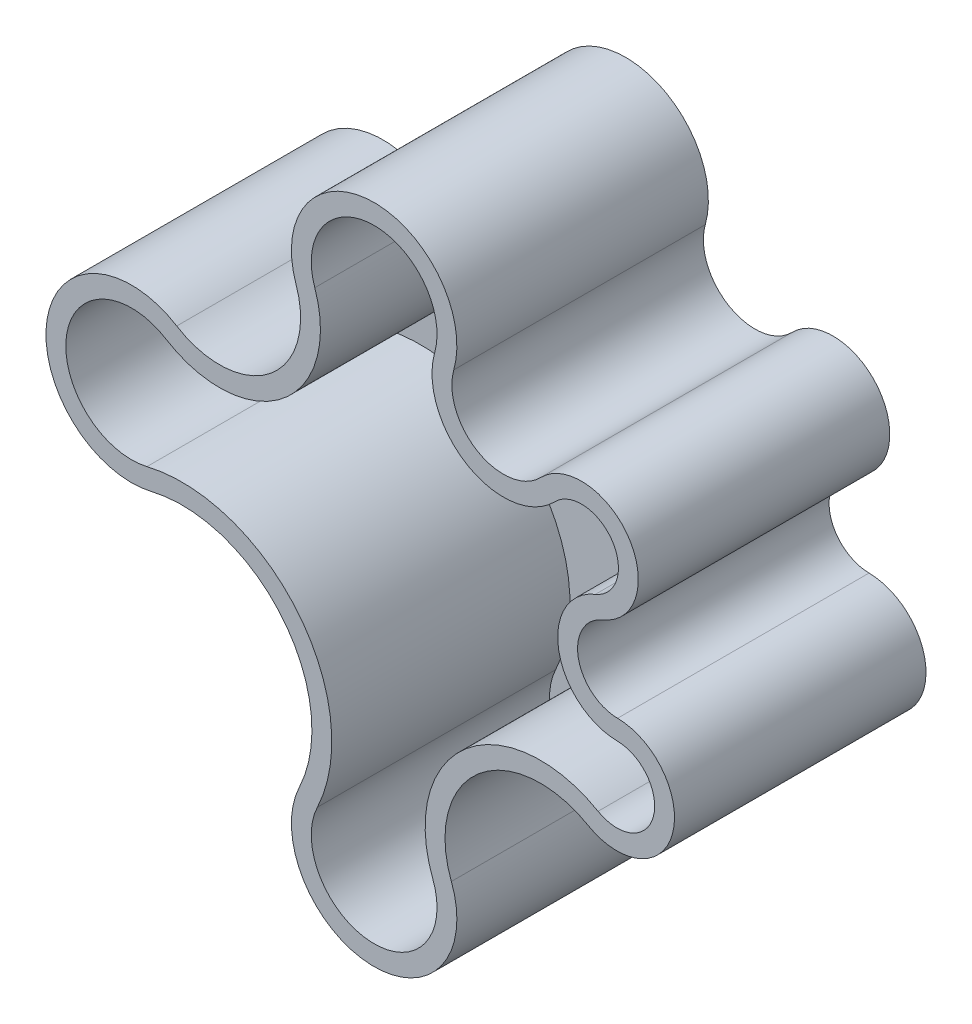
ISO-10303-21;
HEADER;
FILE_DESCRIPTION(('STEP AP214'),'2;1');
FILE_NAME('part.step','',(''),(''),'','','');
FILE_SCHEMA(('AUTOMOTIVE_DESIGN { 1 0 10303 214 1 1 1 1 }'));
ENDSEC;
DATA;
#1=APPLICATION_CONTEXT('core data for automotive mechanical design processes');
#2=APPLICATION_PROTOCOL_DEFINITION('international standard','automotive_design',2000,#1);
#3=PRODUCT_CONTEXT('',#1,'mechanical');
#4=PRODUCT('Part','Part','',(#3));
#5=PRODUCT_RELATED_PRODUCT_CATEGORY('part','',(#4));
#6=PRODUCT_DEFINITION_FORMATION('','',#4);
#7=PRODUCT_DEFINITION_CONTEXT('part definition',#1,'design');
#8=PRODUCT_DEFINITION('design','',#6,#7);
#9=PRODUCT_DEFINITION_SHAPE('','',#8);
#10=(LENGTH_UNIT() NAMED_UNIT(*) SI_UNIT(.MILLI.,.METRE.));
#11=(NAMED_UNIT(*) PLANE_ANGLE_UNIT() SI_UNIT($,.RADIAN.));
#12=(NAMED_UNIT(*) SI_UNIT($,.STERADIAN.) SOLID_ANGLE_UNIT());
#13=UNCERTAINTY_MEASURE_WITH_UNIT(LENGTH_MEASURE(1.E-05),#10,'distance_accuracy_value','');
#14=(GEOMETRIC_REPRESENTATION_CONTEXT(3) GLOBAL_UNCERTAINTY_ASSIGNED_CONTEXT((#13)) GLOBAL_UNIT_ASSIGNED_CONTEXT((#10,
#11,#12)) REPRESENTATION_CONTEXT('',''));
#15=CARTESIAN_POINT('',(0.,0.,0.));
#16=DIRECTION('',(0.,0.,1.));
#17=DIRECTION('',(1.,0.,0.));
#18=AXIS2_PLACEMENT_3D('',#15,#16,#17);
#19=CARTESIAN_POINT('',(36.8404343984216,7.0023134274037,2.));
#20=DIRECTION('',(0.,0.,-1.));
#21=DIRECTION('',(-1.,0.,0.));
#22=AXIS2_PLACEMENT_3D('',#19,#20,#21);
#23=CYLINDRICAL_SURFACE('',#22,6.10536726810264);
#24=CARTESIAN_POINT('',(36.8404343984216,7.0023134274037,0.));
#25=DIRECTION('',(0.,0.,1.));
#26=DIRECTION('',(1.,0.,0.));
#27=AXIS2_PLACEMENT_3D('',#24,#25,#26);
#28=CIRCLE('',#27,6.10536726810264);
#29=CARTESIAN_POINT('',(34.5476437263875,12.6608132650508,0.));
#30=VERTEX_POINT('',#29);
#31=CARTESIAN_POINT('',(36.7738381987945,0.897309379525085,0.));
#32=VERTEX_POINT('',#31);
#33=EDGE_CURVE('E278',#30,#32,#28,.T.);
#34=ORIENTED_EDGE('',*,*,#33,.F.);
#35=DIRECTION('',(0.,0.,-1.));
#36=VECTOR('',#35,1.);
#37=CARTESIAN_POINT('',(34.5476437263875,12.6608132650508,2.));
#38=LINE('',#37,#36);
#39=CARTESIAN_POINT('',(34.5476437263875,12.6608132650508,38.));
#40=VERTEX_POINT('',#39);
#41=EDGE_CURVE('E11',#40,#30,#38,.T.);
#42=ORIENTED_EDGE('',*,*,#41,.F.);
#43=CARTESIAN_POINT('',(36.8404343984216,7.0023134274037,38.));
#44=DIRECTION('',(0.,0.,-1.));
#45=DIRECTION('',(1.,0.,0.));
#46=AXIS2_PLACEMENT_3D('',#43,#44,#45);
#47=CIRCLE('',#46,6.10536726810264);
#48=CARTESIAN_POINT('',(36.7738381987945,0.897309379525083,38.));
#49=VERTEX_POINT('',#48);
#50=EDGE_CURVE('E275',#49,#40,#47,.T.);
#51=ORIENTED_EDGE('',*,*,#50,.F.);
#52=DIRECTION('',(0.,0.,-1.));
#53=VECTOR('',#52,1.);
#54=CARTESIAN_POINT('',(36.7738381987945,0.897309379525085,2.));
#55=LINE('',#54,#53);
#56=EDGE_CURVE('E308',#49,#32,#55,.T.);
#57=ORIENTED_EDGE('',*,*,#56,.T.);
#58=EDGE_LOOP('',(#34,#42,#51,#57));
#59=FACE_BOUND('',#58,.T.);
#60=ADVANCED_FACE('F35',(#59),#23,.F.);
#61=CARTESIAN_POINT('',(31.3236876204013,20.6173857183572,2.));
#62=DIRECTION('',(0.,0.,-1.));
#63=DIRECTION('',(-1.,0.,0.));
#64=AXIS2_PLACEMENT_3D('',#61,#62,#63);
#65=CYLINDRICAL_SURFACE('',#64,8.58492505372287);
#66=CARTESIAN_POINT('',(31.3236876204013,20.6173857183572,0.));
#67=DIRECTION('',(0.,0.,1.));
#68=DIRECTION('',(1.,0.,0.));
#69=AXIS2_PLACEMENT_3D('',#66,#67,#68);
#70=CIRCLE('',#69,8.58492505372287);
#71=CARTESIAN_POINT('',(25.1510926156939,26.5839600358278,0.));
#72=VERTEX_POINT('',#71);
#73=EDGE_CURVE('E281',#30,#72,#70,.T.);
#74=ORIENTED_EDGE('',*,*,#73,.T.);
#75=DIRECTION('',(0.,0.,-1.));
#76=VECTOR('',#75,1.);
#77=CARTESIAN_POINT('',(25.1510926156939,26.5839600358278,2.));
#78=LINE('',#77,#76);
#79=CARTESIAN_POINT('',(25.1510926156939,26.5839600358278,38.));
#80=VERTEX_POINT('',#79);
#81=EDGE_CURVE('E42',#80,#72,#78,.T.);
#82=ORIENTED_EDGE('',*,*,#81,.F.);
#83=CARTESIAN_POINT('',(31.3236876204013,20.6173857183572,38.));
#84=DIRECTION('',(0.,0.,1.));
#85=DIRECTION('',(1.,0.,0.));
#86=AXIS2_PLACEMENT_3D('',#83,#84,#85);
#87=CIRCLE('',#86,8.58492505372287);
#88=EDGE_CURVE('E184',#40,#80,#87,.T.);
#89=ORIENTED_EDGE('',*,*,#88,.F.);
#90=ORIENTED_EDGE('',*,*,#41,.T.);
#91=EDGE_LOOP('',(#74,#82,#89,#90));
#92=FACE_BOUND('',#91,.T.);
#93=ADVANCED_FACE('F330',(#92),#65,.T.);
#94=CARTESIAN_POINT('',(19.5425943505495,32.0052652863536,2.));
#95=DIRECTION('',(0.,0.,-1.));
#96=DIRECTION('',(-1.,0.,0.));
#97=AXIS2_PLACEMENT_3D('',#94,#95,#96);
#98=CYLINDRICAL_SURFACE('',#97,7.80037200455894);
#99=CARTESIAN_POINT('',(19.5425943505495,32.0052652863536,0.));
#100=DIRECTION('',(0.,0.,1.));
#101=DIRECTION('',(1.,0.,0.));
#102=AXIS2_PLACEMENT_3D('',#99,#100,#101);
#103=CIRCLE('',#102,7.80037200455894);
#104=CARTESIAN_POINT('',(12.0333966947507,34.1166046659068,0.));
#105=VERTEX_POINT('',#104);
#106=EDGE_CURVE('E284',#105,#72,#103,.T.);
#107=ORIENTED_EDGE('',*,*,#106,.F.);
#108=DIRECTION('',(0.,0.,-1.));
#109=VECTOR('',#108,1.);
#110=CARTESIAN_POINT('',(12.0333966947507,34.1166046659068,2.));
#111=LINE('',#110,#109);
#112=CARTESIAN_POINT('',(12.0333966947507,34.1166046659068,38.));
#113=VERTEX_POINT('',#112);
#114=EDGE_CURVE('E322',#113,#105,#111,.T.);
#115=ORIENTED_EDGE('',*,*,#114,.F.);
#116=CARTESIAN_POINT('',(19.5425943505495,32.0052652863536,38.));
#117=DIRECTION('',(0.,0.,-1.));
#118=DIRECTION('',(1.,0.,0.));
#119=AXIS2_PLACEMENT_3D('',#116,#117,#118);
#120=CIRCLE('',#119,7.80037200455893);
#121=EDGE_CURVE('E251',#80,#113,#120,.T.);
#122=ORIENTED_EDGE('',*,*,#121,.F.);
#123=ORIENTED_EDGE('',*,*,#81,.T.);
#124=EDGE_LOOP('',(#107,#115,#122,#123));
#125=FACE_BOUND('',#124,.T.);
#126=ADVANCED_FACE('F326',(#125),#98,.F.);
#127=CARTESIAN_POINT('',(0.,37.5,2.));
#128=DIRECTION('',(0.,0.,-1.));
#129=DIRECTION('',(-1.,0.,0.));
#130=AXIS2_PLACEMENT_3D('',#127,#128,#129);
#131=CYLINDRICAL_SURFACE('',#130,12.5);
#132=CARTESIAN_POINT('',(0.,37.5,0.));
#133=DIRECTION('',(0.,0.,1.));
#134=DIRECTION('',(1.,0.,0.));
#135=AXIS2_PLACEMENT_3D('',#132,#133,#134);
#136=CIRCLE('',#135,12.5);
#137=CARTESIAN_POINT('',(-11.7997431739064,33.3749471482355,0.));
#138=VERTEX_POINT('',#137);
#139=EDGE_CURVE('E287',#105,#138,#136,.T.);
#140=ORIENTED_EDGE('',*,*,#139,.T.);
#141=DIRECTION('',(0.,0.,-1.));
#142=VECTOR('',#141,1.);
#143=CARTESIAN_POINT('',(-11.7997431739064,33.3749471482355,2.));
#144=LINE('',#143,#142);
#145=CARTESIAN_POINT('',(-11.7997431739064,33.3749471482356,38.));
#146=VERTEX_POINT('',#145);
#147=EDGE_CURVE('E320',#146,#138,#144,.T.);
#148=ORIENTED_EDGE('',*,*,#147,.F.);
#149=CARTESIAN_POINT('',(0.,37.5,38.));
#150=DIRECTION('',(0.,0.,1.));
#151=DIRECTION('',(1.,0.,0.));
#152=AXIS2_PLACEMENT_3D('',#149,#150,#151);
#153=CIRCLE('',#152,12.5);
#154=EDGE_CURVE('E254',#113,#146,#153,.T.);
#155=ORIENTED_EDGE('',*,*,#154,.F.);
#156=ORIENTED_EDGE('',*,*,#114,.T.);
#157=EDGE_LOOP('',(#140,#148,#155,#156));
#158=FACE_BOUND('',#157,.T.);
#159=ADVANCED_FACE('F338',(#158),#131,.T.);
#160=CARTESIAN_POINT('',(-23.3637908302133,29.3322907056719,2.));
#161=DIRECTION('',(0.,0.,-1.));
#162=DIRECTION('',(-1.,0.,0.));
#163=AXIS2_PLACEMENT_3D('',#160,#161,#162);
#164=CYLINDRICAL_SURFACE('',#163,12.2503171105869);
#165=CARTESIAN_POINT('',(-23.3637908302133,29.3322907056719,0.));
#166=DIRECTION('',(0.,0.,1.));
#167=DIRECTION('',(1.,0.,0.));
#168=AXIS2_PLACEMENT_3D('',#165,#166,#167);
#169=CIRCLE('',#168,12.2503171105869);
#170=CARTESIAN_POINT('',(-29.826287651924,18.9252544253798,0.));
#171=VERTEX_POINT('',#170);
#172=EDGE_CURVE('E290',#171,#138,#169,.T.);
#173=ORIENTED_EDGE('',*,*,#172,.F.);
#174=DIRECTION('',(0.,0.,-1.));
#175=VECTOR('',#174,1.);
#176=CARTESIAN_POINT('',(-29.826287651924,18.9252544253798,2.));
#177=LINE('',#176,#175);
#178=CARTESIAN_POINT('',(-29.826287651924,18.9252544253798,38.));
#179=VERTEX_POINT('',#178);
#180=EDGE_CURVE('E318',#179,#171,#177,.T.);
#181=ORIENTED_EDGE('',*,*,#180,.F.);
#182=CARTESIAN_POINT('',(-23.3637908302133,29.3322907056719,38.));
#183=DIRECTION('',(0.,0.,-1.));
#184=DIRECTION('',(1.,0.,0.));
#185=AXIS2_PLACEMENT_3D('',#182,#183,#184);
#186=CIRCLE('',#185,12.2503171105869);
#187=EDGE_CURVE('E257',#146,#179,#186,.T.);
#188=ORIENTED_EDGE('',*,*,#187,.F.);
#189=ORIENTED_EDGE('',*,*,#147,.T.);
#190=EDGE_LOOP('',(#173,#181,#188,#189));
#191=FACE_BOUND('',#190,.T.);
#192=ADVANCED_FACE('F363',(#191),#164,.F.);
#193=CARTESIAN_POINT('',(-36.65081802599,7.93520875754155,2.));
#194=DIRECTION('',(0.,0.,-1.));
#195=DIRECTION('',(-1.,0.,0.));
#196=AXIS2_PLACEMENT_3D('',#193,#194,#195);
#197=CYLINDRICAL_SURFACE('',#196,12.9365883681796);
#198=CARTESIAN_POINT('',(-36.65081802599,7.93520875754155,0.));
#199=DIRECTION('',(0.,0.,1.));
#200=DIRECTION('',(1.,0.,0.));
#201=AXIS2_PLACEMENT_3D('',#198,#199,#200);
#202=CIRCLE('',#201,12.9365883681796);
#203=CARTESIAN_POINT('',(-33.6258913301173,-4.64275360097727,0.));
#204=VERTEX_POINT('',#203);
#205=EDGE_CURVE('E293',#171,#204,#202,.T.);
#206=ORIENTED_EDGE('',*,*,#205,.T.);
#207=DIRECTION('',(0.,0.,-1.));
#208=VECTOR('',#207,1.);
#209=CARTESIAN_POINT('',(-33.6258913301173,-4.64275360097727,2.));
#210=LINE('',#209,#208);
#211=CARTESIAN_POINT('',(-33.6258913301173,-4.64275360097726,38.));
#212=VERTEX_POINT('',#211);
#213=EDGE_CURVE('E316',#212,#204,#210,.T.);
#214=ORIENTED_EDGE('',*,*,#213,.F.);
#215=CARTESIAN_POINT('',(-36.65081802599,7.93520875754155,38.));
#216=DIRECTION('',(0.,0.,1.));
#217=DIRECTION('',(1.,0.,0.));
#218=AXIS2_PLACEMENT_3D('',#215,#216,#217);
#219=CIRCLE('',#218,12.9365883681796);
#220=EDGE_CURVE('E260',#179,#212,#219,.T.);
#221=ORIENTED_EDGE('',*,*,#220,.F.);
#222=ORIENTED_EDGE('',*,*,#180,.T.);
#223=EDGE_LOOP('',(#206,#214,#221,#222));
#224=FACE_BOUND('',#223,.T.);
#225=ADVANCED_FACE('F361',(#224),#197,.T.);
#226=CARTESIAN_POINT('',(-29.0349762751784,-23.7322597470159,2.));
#227=DIRECTION('',(0.,0.,-1.));
#228=DIRECTION('',(-1.,0.,0.));
#229=AXIS2_PLACEMENT_3D('',#226,#227,#228);
#230=CYLINDRICAL_SURFACE('',#229,19.6337909212998);
#231=CARTESIAN_POINT('',(-29.0349762751784,-23.7322597470159,0.));
#232=DIRECTION('',(0.,0.,1.));
#233=DIRECTION('',(1.,0.,0.));
#234=AXIS2_PLACEMENT_3D('',#231,#232,#233);
#235=CIRCLE('',#234,19.6337909212998);
#236=CARTESIAN_POINT('',(-11.2945654102441,-32.1443681797834,0.));
#237=VERTEX_POINT('',#236);
#238=EDGE_CURVE('E296',#237,#204,#235,.T.);
#239=ORIENTED_EDGE('',*,*,#238,.F.);
#240=DIRECTION('',(0.,0.,-1.));
#241=VECTOR('',#240,1.);
#242=CARTESIAN_POINT('',(-11.2945654102441,-32.1443681797834,2.));
#243=LINE('',#242,#241);
#244=CARTESIAN_POINT('',(-11.2945654102441,-32.1443681797834,38.));
#245=VERTEX_POINT('',#244);
#246=EDGE_CURVE('E314',#245,#237,#243,.T.);
#247=ORIENTED_EDGE('',*,*,#246,.F.);
#248=CARTESIAN_POINT('',(-29.0349762751784,-23.7322597470159,38.));
#249=DIRECTION('',(0.,0.,-1.));
#250=DIRECTION('',(1.,0.,0.));
#251=AXIS2_PLACEMENT_3D('',#248,#249,#250);
#252=CIRCLE('',#251,19.6337909212998);
#253=EDGE_CURVE('E263',#212,#245,#252,.T.);
#254=ORIENTED_EDGE('',*,*,#253,.F.);
#255=ORIENTED_EDGE('',*,*,#213,.T.);
#256=EDGE_LOOP('',(#239,#247,#254,#255));
#257=FACE_BOUND('',#256,.T.);
#258=ADVANCED_FACE('F357',(#257),#230,.F.);
#259=CARTESIAN_POINT('',(0.,-37.5,2.));
#260=DIRECTION('',(0.,0.,-1.));
#261=DIRECTION('',(-1.,0.,0.));
#262=AXIS2_PLACEMENT_3D('',#259,#260,#261);
#263=CYLINDRICAL_SURFACE('',#262,12.5);
#264=CARTESIAN_POINT('',(0.,-37.5,0.));
#265=DIRECTION('',(0.,0.,1.));
#266=DIRECTION('',(1.,0.,0.));
#267=AXIS2_PLACEMENT_3D('',#264,#265,#266);
#268=CIRCLE('',#267,12.5);
#269=CARTESIAN_POINT('',(11.666927458509,-33.0130407091341,0.));
#270=VERTEX_POINT('',#269);
#271=EDGE_CURVE('E299',#237,#270,#268,.T.);
#272=ORIENTED_EDGE('',*,*,#271,.T.);
#273=DIRECTION('',(0.,0.,-1.));
#274=VECTOR('',#273,1.);
#275=CARTESIAN_POINT('',(11.666927458509,-33.0130407091341,2.));
#276=LINE('',#275,#274);
#277=CARTESIAN_POINT('',(11.666927458509,-33.0130407091341,38.));
#278=VERTEX_POINT('',#277);
#279=EDGE_CURVE('E312',#278,#270,#276,.T.);
#280=ORIENTED_EDGE('',*,*,#279,.F.);
#281=CARTESIAN_POINT('',(0.,-37.5,38.));
#282=DIRECTION('',(0.,0.,1.));
#283=DIRECTION('',(1.,0.,0.));
#284=AXIS2_PLACEMENT_3D('',#281,#282,#283);
#285=CIRCLE('',#284,12.5);
#286=EDGE_CURVE('E266',#245,#278,#285,.T.);
#287=ORIENTED_EDGE('',*,*,#286,.F.);
#288=ORIENTED_EDGE('',*,*,#246,.T.);
#289=EDGE_LOOP('',(#272,#280,#287,#288));
#290=FACE_BOUND('',#289,.T.);
#291=ADVANCED_FACE('F354',(#290),#263,.T.);
#292=CARTESIAN_POINT('',(25.1275337067916,-27.8362542346137,2.));
#293=DIRECTION('',(0.,0.,-1.));
#294=DIRECTION('',(-1.,0.,0.));
#295=AXIS2_PLACEMENT_3D('',#292,#293,#294);
#296=CYLINDRICAL_SURFACE('',#295,14.4217557451956);
#297=CARTESIAN_POINT('',(25.1275337067916,-27.8362542346137,0.));
#298=DIRECTION('',(0.,0.,1.));
#299=DIRECTION('',(1.,0.,0.));
#300=AXIS2_PLACEMENT_3D('',#297,#298,#299);
#301=CIRCLE('',#300,14.4217557451956);
#302=CARTESIAN_POINT('',(32.3318279163684,-15.3428486254157,0.));
#303=VERTEX_POINT('',#302);
#304=EDGE_CURVE('E302',#303,#270,#301,.T.);
#305=ORIENTED_EDGE('',*,*,#304,.F.);
#306=DIRECTION('',(0.,0.,-1.));
#307=VECTOR('',#306,1.);
#308=CARTESIAN_POINT('',(32.3318279163684,-15.3428486254157,2.));
#309=LINE('',#308,#307);
#310=CARTESIAN_POINT('',(32.3318279163684,-15.3428486254157,38.));
#311=VERTEX_POINT('',#310);
#312=EDGE_CURVE('E310',#311,#303,#309,.T.);
#313=ORIENTED_EDGE('',*,*,#312,.F.);
#314=CARTESIAN_POINT('',(25.1275337067916,-27.8362542346137,38.));
#315=DIRECTION('',(0.,0.,-1.));
#316=DIRECTION('',(1.,0.,0.));
#317=AXIS2_PLACEMENT_3D('',#314,#315,#316);
#318=CIRCLE('',#317,14.4217557451956);
#319=EDGE_CURVE('E269',#278,#311,#318,.T.);
#320=ORIENTED_EDGE('',*,*,#319,.F.);
#321=ORIENTED_EDGE('',*,*,#279,.T.);
#322=EDGE_LOOP('',(#305,#313,#320,#321));
#323=FACE_BOUND('',#322,.T.);
#324=ADVANCED_FACE('F350',(#323),#296,.F.);
#325=CARTESIAN_POINT('',(36.6789170697903,-7.80429641847651,2.));
#326=DIRECTION('',(0.,0.,-1.));
#327=DIRECTION('',(-1.,0.,0.));
#328=AXIS2_PLACEMENT_3D('',#325,#326,#327);
#329=CYLINDRICAL_SURFACE('',#328,8.70212350432619);
#330=CARTESIAN_POINT('',(36.6789170697903,-7.80429641847651,0.));
#331=DIRECTION('',(0.,0.,1.));
#332=DIRECTION('',(1.,0.,0.));
#333=AXIS2_PLACEMENT_3D('',#330,#331,#332);
#334=CIRCLE('',#333,8.70212350432619);
#335=EDGE_CURVE('E305',#303,#32,#334,.T.);
#336=ORIENTED_EDGE('',*,*,#335,.T.);
#337=ORIENTED_EDGE('',*,*,#56,.F.);
#338=CARTESIAN_POINT('',(36.6789170697903,-7.80429641847651,38.));
#339=DIRECTION('',(0.,0.,1.));
#340=DIRECTION('',(1.,0.,0.));
#341=AXIS2_PLACEMENT_3D('',#338,#339,#340);
#342=CIRCLE('',#341,8.70212350432619);
#343=EDGE_CURVE('E272',#311,#49,#342,.T.);
#344=ORIENTED_EDGE('',*,*,#343,.F.);
#345=ORIENTED_EDGE('',*,*,#312,.T.);
#346=EDGE_LOOP('',(#336,#337,#344,#345));
#347=FACE_BOUND('',#346,.T.);
#348=ADVANCED_FACE('F364',(#347),#329,.T.);
#349=CARTESIAN_POINT('',(0.,0.,0.));
#350=DIRECTION('',(0.,0.,1.));
#351=DIRECTION('',(1.,0.,0.));
#352=AXIS2_PLACEMENT_3D('',#349,#350,#351);
#353=PLANE('',#352);
#354=ORIENTED_EDGE('',*,*,#33,.T.);
#355=ORIENTED_EDGE('',*,*,#335,.F.);
#356=ORIENTED_EDGE('',*,*,#304,.T.);
#357=ORIENTED_EDGE('',*,*,#271,.F.);
#358=ORIENTED_EDGE('',*,*,#238,.T.);
#359=ORIENTED_EDGE('',*,*,#205,.F.);
#360=ORIENTED_EDGE('',*,*,#172,.T.);
#361=ORIENTED_EDGE('',*,*,#139,.F.);
#362=ORIENTED_EDGE('',*,*,#106,.T.);
#363=ORIENTED_EDGE('',*,*,#73,.F.);
#364=EDGE_LOOP('',(#354,#355,#356,#357,#358,#359,#360,#361,#362,#363));
#365=FACE_BOUND('',#364,.T.);
#366=ADVANCED_FACE('F334',(#365),#353,.F.);
#367=CARTESIAN_POINT('',(25.4331409854754,26.3113255023554,38.));
#368=DIRECTION('',(0.,0.,1.));
#369=DIRECTION('',(1.,0.,0.));
#370=AXIS2_PLACEMENT_3D('',#367,#368,#369);
#371=PLANE('',#370);
#372=ORIENTED_EDGE('',*,*,#88,.T.);
#373=ORIENTED_EDGE('',*,*,#121,.T.);
#374=ORIENTED_EDGE('',*,*,#154,.T.);
#375=ORIENTED_EDGE('',*,*,#187,.T.);
#376=ORIENTED_EDGE('',*,*,#220,.T.);
#377=ORIENTED_EDGE('',*,*,#253,.T.);
#378=ORIENTED_EDGE('',*,*,#286,.T.);
#379=ORIENTED_EDGE('',*,*,#319,.T.);
#380=ORIENTED_EDGE('',*,*,#343,.T.);
#381=ORIENTED_EDGE('',*,*,#50,.T.);
#382=EDGE_LOOP('',(#372,#373,#374,#375,#376,#377,#378,#379,#380,#381));
#383=FACE_BOUND('',#382,.T.);
#384=CARTESIAN_POINT('',(-29.0349762751784,-23.7322597470159,38.));
#385=DIRECTION('',(0.,0.,-1.));
#386=DIRECTION('',(1.,0.,0.));
#387=AXIS2_PLACEMENT_3D('',#384,#385,#386);
#388=CIRCLE('',#387,22.6337909212998);
#389=CARTESIAN_POINT('',(-34.3273730368352,-1.72591911559073,38.));
#390=VERTEX_POINT('',#389);
#391=CARTESIAN_POINT('',(-8.58386971178554,-33.4297198166354,38.));
#392=VERTEX_POINT('',#391);
#393=EDGE_CURVE('E178',#390,#392,#388,.T.);
#394=ORIENTED_EDGE('',*,*,#393,.F.);
#395=CARTESIAN_POINT('',(-36.65081802599,7.93520875754155,38.));
#396=DIRECTION('',(0.,0.,1.));
#397=DIRECTION('',(1.,0.,0.));
#398=AXIS2_PLACEMENT_3D('',#395,#396,#397);
#399=CIRCLE('',#398,9.9365883681796);
#400=CARTESIAN_POINT('',(-31.4088989663999,16.3766584536156,38.));
#401=VERTEX_POINT('',#400);
#402=EDGE_CURVE('E169',#401,#390,#399,.T.);
#403=ORIENTED_EDGE('',*,*,#402,.F.);
#404=CARTESIAN_POINT('',(-23.3637908302133,29.3322907056719,38.));
#405=DIRECTION('',(0.,0.,-1.));
#406=DIRECTION('',(1.,0.,0.));
#407=AXIS2_PLACEMENT_3D('',#404,#405,#406);
#408=CIRCLE('',#407,15.2503171105869);
#409=CARTESIAN_POINT('',(-8.96780481216884,34.364959832659,38.));
#410=VERTEX_POINT('',#409);
#411=EDGE_CURVE('E207',#410,#401,#408,.T.);
#412=ORIENTED_EDGE('',*,*,#411,.F.);
#413=CARTESIAN_POINT('',(0.,37.5,38.));
#414=DIRECTION('',(0.,0.,1.));
#415=DIRECTION('',(1.,0.,0.));
#416=AXIS2_PLACEMENT_3D('',#413,#414,#415);
#417=CIRCLE('',#416,9.5);
#418=CARTESIAN_POINT('',(9.14538148801052,34.9286195460892,38.));
#419=VERTEX_POINT('',#418);
#420=EDGE_CURVE('E204',#419,#410,#417,.T.);
#421=ORIENTED_EDGE('',*,*,#420,.F.);
#422=CARTESIAN_POINT('',(19.5425943505495,32.0052652863536,38.));
#423=DIRECTION('',(0.,0.,-1.));
#424=DIRECTION('',(1.,0.,0.));
#425=AXIS2_PLACEMENT_3D('',#422,#423,#424);
#426=CIRCLE('',#425,10.8003720045589);
#427=CARTESIAN_POINT('',(27.3081044589239,24.4989420723163,38.));
#428=VERTEX_POINT('',#427);
#429=EDGE_CURVE('E202',#428,#419,#426,.T.);
#430=ORIENTED_EDGE('',*,*,#429,.F.);
#431=CARTESIAN_POINT('',(31.3236876204013,20.6173857183572,38.));
#432=DIRECTION('',(0.,0.,1.));
#433=DIRECTION('',(1.,0.,0.));
#434=AXIS2_PLACEMENT_3D('',#431,#432,#433);
#435=CIRCLE('',#434,5.58492505372287);
#436=CARTESIAN_POINT('',(33.4210330387654,15.4412355996136,38.));
#437=VERTEX_POINT('',#436);
#438=EDGE_CURVE('E200',#437,#428,#435,.T.);
#439=ORIENTED_EDGE('',*,*,#438,.F.);
#440=CARTESIAN_POINT('',(36.8404343984216,7.0023134274037,38.));
#441=DIRECTION('',(0.,0.,-1.));
#442=DIRECTION('',(1.,0.,0.));
#443=AXIS2_PLACEMENT_3D('',#440,#441,#442);
#444=CIRCLE('',#443,9.10536726810264);
#445=CARTESIAN_POINT('',(36.7411147621677,-2.1025121446152,38.));
#446=VERTEX_POINT('',#445);
#447=EDGE_CURVE('E198',#446,#437,#444,.T.);
#448=ORIENTED_EDGE('',*,*,#447,.F.);
#449=CARTESIAN_POINT('',(36.6789170697903,-7.80429641847651,38.));
#450=DIRECTION('',(0.,0.,1.));
#451=DIRECTION('',(1.,0.,0.));
#452=AXIS2_PLACEMENT_3D('',#449,#450,#451);
#453=CIRCLE('',#452,5.70212350432619);
#454=CARTESIAN_POINT('',(33.8304583890091,-12.743982198207,38.));
#455=VERTEX_POINT('',#454);
#456=EDGE_CURVE('E196',#455,#446,#453,.T.);
#457=ORIENTED_EDGE('',*,*,#456,.F.);
#458=CARTESIAN_POINT('',(25.1275337067916,-27.8362542346137,38.));
#459=DIRECTION('',(0.,0.,-1.));
#460=DIRECTION('',(1.,0.,0.));
#461=AXIS2_PLACEMENT_3D('',#458,#459,#460);
#462=CIRCLE('',#461,17.4217557451956);
#463=CARTESIAN_POINT('',(8.86686486846686,-34.0899109389419,38.));
#464=VERTEX_POINT('',#463);
#465=EDGE_CURVE('E192',#464,#455,#462,.T.);
#466=ORIENTED_EDGE('',*,*,#465,.F.);
#467=CARTESIAN_POINT('',(0.,-37.5,38.));
#468=DIRECTION('',(0.,0.,1.));
#469=DIRECTION('',(1.,0.,0.));
#470=AXIS2_PLACEMENT_3D('',#467,#468,#469);
#471=CIRCLE('',#470,9.5);
#472=EDGE_CURVE('E190',#392,#464,#471,.T.);
#473=ORIENTED_EDGE('',*,*,#472,.F.);
#474=EDGE_LOOP('',(#394,#403,#412,#421,#430,#439,#448,#457,#466,#473));
#475=FACE_BOUND('',#474,.T.);
#476=ADVANCED_FACE('F188',(#383,#475),#371,.T.);
#477=CARTESIAN_POINT('',(-36.65081802599,7.93520875754155,38.));
#478=DIRECTION('',(0.,0.,-1.));
#479=DIRECTION('',(-1.,0.,0.));
#480=AXIS2_PLACEMENT_3D('',#477,#478,#479);
#481=CYLINDRICAL_SURFACE('',#480,9.9365883681796);
#482=CARTESIAN_POINT('',(-36.65081802599,7.93520875754155,2.));
#483=DIRECTION('',(0.,0.,1.));
#484=DIRECTION('',(1.,0.,0.));
#485=AXIS2_PLACEMENT_3D('',#482,#483,#484);
#486=CIRCLE('',#485,9.9365883681796);
#487=CARTESIAN_POINT('',(-31.4088989663999,16.3766584536156,2.));
#488=VERTEX_POINT('',#487);
#489=CARTESIAN_POINT('',(-34.3273730368352,-1.72591911559073,2.));
#490=VERTEX_POINT('',#489);
#491=EDGE_CURVE('E49',#488,#490,#486,.T.);
#492=ORIENTED_EDGE('',*,*,#491,.F.);
#493=DIRECTION('',(0.,0.,-1.));
#494=VECTOR('',#493,1.);
#495=CARTESIAN_POINT('',(-31.4088989663999,16.3766584536156,38.));
#496=LINE('',#495,#494);
#497=EDGE_CURVE('E174',#401,#488,#496,.T.);
#498=ORIENTED_EDGE('',*,*,#497,.F.);
#499=ORIENTED_EDGE('',*,*,#402,.T.);
#500=DIRECTION('',(0.,0.,-1.));
#501=VECTOR('',#500,1.);
#502=CARTESIAN_POINT('',(-34.3273730368352,-1.72591911559073,38.));
#503=LINE('',#502,#501);
#504=EDGE_CURVE('E172',#390,#490,#503,.T.);
#505=ORIENTED_EDGE('',*,*,#504,.T.);
#506=EDGE_LOOP('',(#492,#498,#499,#505));
#507=FACE_BOUND('',#506,.T.);
#508=ADVANCED_FACE('F171',(#507),#481,.F.);
#509=CARTESIAN_POINT('',(-29.0349762751784,-23.7322597470159,38.));
#510=DIRECTION('',(0.,0.,-1.));
#511=DIRECTION('',(-1.,0.,0.));
#512=AXIS2_PLACEMENT_3D('',#509,#510,#511);
#513=CYLINDRICAL_SURFACE('',#512,22.6337909212998);
#514=CARTESIAN_POINT('',(-29.0349762751784,-23.7322597470159,2.));
#515=DIRECTION('',(0.,0.,-1.));
#516=DIRECTION('',(1.,0.,0.));
#517=AXIS2_PLACEMENT_3D('',#514,#515,#516);
#518=CIRCLE('',#517,22.6337909212998);
#519=CARTESIAN_POINT('',(-8.58386971178554,-33.4297198166354,2.));
#520=VERTEX_POINT('',#519);
#521=EDGE_CURVE('E53',#490,#520,#518,.T.);
#522=ORIENTED_EDGE('',*,*,#521,.F.);
#523=ORIENTED_EDGE('',*,*,#504,.F.);
#524=ORIENTED_EDGE('',*,*,#393,.T.);
#525=DIRECTION('',(0.,0.,-1.));
#526=VECTOR('',#525,1.);
#527=CARTESIAN_POINT('',(-8.58386971178554,-33.4297198166354,38.));
#528=LINE('',#527,#526);
#529=EDGE_CURVE('E185',#392,#520,#528,.T.);
#530=ORIENTED_EDGE('',*,*,#529,.T.);
#531=EDGE_LOOP('',(#522,#523,#524,#530));
#532=FACE_BOUND('',#531,.T.);
#533=ADVANCED_FACE('F182',(#532),#513,.T.);
#534=CARTESIAN_POINT('',(0.,-37.5,38.));
#535=DIRECTION('',(0.,0.,-1.));
#536=DIRECTION('',(-1.,0.,0.));
#537=AXIS2_PLACEMENT_3D('',#534,#535,#536);
#538=CYLINDRICAL_SURFACE('',#537,9.5);
#539=CARTESIAN_POINT('',(0.,-37.5,2.));
#540=DIRECTION('',(0.,0.,1.));
#541=DIRECTION('',(1.,0.,0.));
#542=AXIS2_PLACEMENT_3D('',#539,#540,#541);
#543=CIRCLE('',#542,9.5);
#544=CARTESIAN_POINT('',(8.86686486846686,-34.0899109389419,2.));
#545=VERTEX_POINT('',#544);
#546=EDGE_CURVE('E211',#520,#545,#543,.T.);
#547=ORIENTED_EDGE('',*,*,#546,.F.);
#548=ORIENTED_EDGE('',*,*,#529,.F.);
#549=ORIENTED_EDGE('',*,*,#472,.T.);
#550=DIRECTION('',(0.,0.,-1.));
#551=VECTOR('',#550,1.);
#552=CARTESIAN_POINT('',(8.86686486846686,-34.0899109389419,38.));
#553=LINE('',#552,#551);
#554=EDGE_CURVE('E245',#464,#545,#553,.T.);
#555=ORIENTED_EDGE('',*,*,#554,.T.);
#556=EDGE_LOOP('',(#547,#548,#549,#555));
#557=FACE_BOUND('',#556,.T.);
#558=ADVANCED_FACE('F430',(#557),#538,.F.);
#559=CARTESIAN_POINT('',(25.1275337067916,-27.8362542346137,38.));
#560=DIRECTION('',(0.,0.,-1.));
#561=DIRECTION('',(-1.,0.,0.));
#562=AXIS2_PLACEMENT_3D('',#559,#560,#561);
#563=CYLINDRICAL_SURFACE('',#562,17.4217557451956);
#564=CARTESIAN_POINT('',(25.1275337067916,-27.8362542346137,2.));
#565=DIRECTION('',(0.,0.,-1.));
#566=DIRECTION('',(1.,0.,0.));
#567=AXIS2_PLACEMENT_3D('',#564,#565,#566);
#568=CIRCLE('',#567,17.4217557451956);
#569=CARTESIAN_POINT('',(33.8304583890091,-12.743982198207,2.));
#570=VERTEX_POINT('',#569);
#571=EDGE_CURVE('E213',#545,#570,#568,.T.);
#572=ORIENTED_EDGE('',*,*,#571,.F.);
#573=ORIENTED_EDGE('',*,*,#554,.F.);
#574=ORIENTED_EDGE('',*,*,#465,.T.);
#575=DIRECTION('',(0.,0.,-1.));
#576=VECTOR('',#575,1.);
#577=CARTESIAN_POINT('',(33.8304583890091,-12.743982198207,38.));
#578=LINE('',#577,#576);
#579=EDGE_CURVE('E242',#455,#570,#578,.T.);
#580=ORIENTED_EDGE('',*,*,#579,.T.);
#581=EDGE_LOOP('',(#572,#573,#574,#580));
#582=FACE_BOUND('',#581,.T.);
#583=ADVANCED_FACE('F439',(#582),#563,.T.);
#584=CARTESIAN_POINT('',(36.6789170697903,-7.80429641847651,38.));
#585=DIRECTION('',(0.,0.,-1.));
#586=DIRECTION('',(-1.,0.,0.));
#587=AXIS2_PLACEMENT_3D('',#584,#585,#586);
#588=CYLINDRICAL_SURFACE('',#587,5.70212350432619);
#589=CARTESIAN_POINT('',(36.6789170697903,-7.80429641847651,2.));
#590=DIRECTION('',(0.,0.,1.));
#591=DIRECTION('',(1.,0.,0.));
#592=AXIS2_PLACEMENT_3D('',#589,#590,#591);
#593=CIRCLE('',#592,5.70212350432619);
#594=CARTESIAN_POINT('',(36.7411147621677,-2.1025121446152,2.));
#595=VERTEX_POINT('',#594);
#596=EDGE_CURVE('E215',#570,#595,#593,.T.);
#597=ORIENTED_EDGE('',*,*,#596,.F.);
#598=ORIENTED_EDGE('',*,*,#579,.F.);
#599=ORIENTED_EDGE('',*,*,#456,.T.);
#600=DIRECTION('',(0.,0.,-1.));
#601=VECTOR('',#600,1.);
#602=CARTESIAN_POINT('',(36.7411147621677,-2.1025121446152,38.));
#603=LINE('',#602,#601);
#604=EDGE_CURVE('E239',#446,#595,#603,.T.);
#605=ORIENTED_EDGE('',*,*,#604,.T.);
#606=EDGE_LOOP('',(#597,#598,#599,#605));
#607=FACE_BOUND('',#606,.T.);
#608=ADVANCED_FACE('F449',(#607),#588,.F.);
#609=CARTESIAN_POINT('',(36.8404343984216,7.0023134274037,38.));
#610=DIRECTION('',(0.,0.,-1.));
#611=DIRECTION('',(-1.,0.,0.));
#612=AXIS2_PLACEMENT_3D('',#609,#610,#611);
#613=CYLINDRICAL_SURFACE('',#612,9.10536726810264);
#614=CARTESIAN_POINT('',(36.8404343984216,7.0023134274037,2.));
#615=DIRECTION('',(0.,0.,-1.));
#616=DIRECTION('',(1.,0.,0.));
#617=AXIS2_PLACEMENT_3D('',#614,#615,#616);
#618=CIRCLE('',#617,9.10536726810264);
#619=CARTESIAN_POINT('',(33.4210330387654,15.4412355996136,2.));
#620=VERTEX_POINT('',#619);
#621=EDGE_CURVE('E217',#595,#620,#618,.T.);
#622=ORIENTED_EDGE('',*,*,#621,.F.);
#623=ORIENTED_EDGE('',*,*,#604,.F.);
#624=ORIENTED_EDGE('',*,*,#447,.T.);
#625=DIRECTION('',(0.,0.,-1.));
#626=VECTOR('',#625,1.);
#627=CARTESIAN_POINT('',(33.4210330387654,15.4412355996136,38.));
#628=LINE('',#627,#626);
#629=EDGE_CURVE('E236',#437,#620,#628,.T.);
#630=ORIENTED_EDGE('',*,*,#629,.T.);
#631=EDGE_LOOP('',(#622,#623,#624,#630));
#632=FACE_BOUND('',#631,.T.);
#633=ADVANCED_FACE('F459',(#632),#613,.T.);
#634=CARTESIAN_POINT('',(31.3236876204013,20.6173857183572,38.));
#635=DIRECTION('',(0.,0.,-1.));
#636=DIRECTION('',(-1.,0.,0.));
#637=AXIS2_PLACEMENT_3D('',#634,#635,#636);
#638=CYLINDRICAL_SURFACE('',#637,5.58492505372287);
#639=CARTESIAN_POINT('',(31.3236876204013,20.6173857183572,2.));
#640=DIRECTION('',(0.,0.,1.));
#641=DIRECTION('',(1.,0.,0.));
#642=AXIS2_PLACEMENT_3D('',#639,#640,#641);
#643=CIRCLE('',#642,5.58492505372287);
#644=CARTESIAN_POINT('',(27.3081044589239,24.4989420723163,2.));
#645=VERTEX_POINT('',#644);
#646=EDGE_CURVE('E219',#620,#645,#643,.T.);
#647=ORIENTED_EDGE('',*,*,#646,.F.);
#648=ORIENTED_EDGE('',*,*,#629,.F.);
#649=ORIENTED_EDGE('',*,*,#438,.T.);
#650=DIRECTION('',(0.,0.,-1.));
#651=VECTOR('',#650,1.);
#652=CARTESIAN_POINT('',(27.3081044589239,24.4989420723163,38.));
#653=LINE('',#652,#651);
#654=EDGE_CURVE('E233',#428,#645,#653,.T.);
#655=ORIENTED_EDGE('',*,*,#654,.T.);
#656=EDGE_LOOP('',(#647,#648,#649,#655));
#657=FACE_BOUND('',#656,.T.);
#658=ADVANCED_FACE('F469',(#657),#638,.F.);
#659=CARTESIAN_POINT('',(19.5425943505495,32.0052652863536,38.));
#660=DIRECTION('',(0.,0.,-1.));
#661=DIRECTION('',(-1.,0.,0.));
#662=AXIS2_PLACEMENT_3D('',#659,#660,#661);
#663=CYLINDRICAL_SURFACE('',#662,10.8003720045589);
#664=CARTESIAN_POINT('',(19.5425943505495,32.0052652863536,2.));
#665=DIRECTION('',(0.,0.,-1.));
#666=DIRECTION('',(1.,0.,0.));
#667=AXIS2_PLACEMENT_3D('',#664,#665,#666);
#668=CIRCLE('',#667,10.8003720045589);
#669=CARTESIAN_POINT('',(9.14538148801052,34.9286195460892,2.));
#670=VERTEX_POINT('',#669);
#671=EDGE_CURVE('E221',#645,#670,#668,.T.);
#672=ORIENTED_EDGE('',*,*,#671,.F.);
#673=ORIENTED_EDGE('',*,*,#654,.F.);
#674=ORIENTED_EDGE('',*,*,#429,.T.);
#675=DIRECTION('',(0.,0.,-1.));
#676=VECTOR('',#675,1.);
#677=CARTESIAN_POINT('',(9.14538148801052,34.9286195460892,38.));
#678=LINE('',#677,#676);
#679=EDGE_CURVE('E230',#419,#670,#678,.T.);
#680=ORIENTED_EDGE('',*,*,#679,.T.);
#681=EDGE_LOOP('',(#672,#673,#674,#680));
#682=FACE_BOUND('',#681,.T.);
#683=ADVANCED_FACE('F479',(#682),#663,.T.);
#684=CARTESIAN_POINT('',(0.,37.5,38.));
#685=DIRECTION('',(0.,0.,-1.));
#686=DIRECTION('',(-1.,0.,0.));
#687=AXIS2_PLACEMENT_3D('',#684,#685,#686);
#688=CYLINDRICAL_SURFACE('',#687,9.5);
#689=CARTESIAN_POINT('',(0.,37.5,2.));
#690=DIRECTION('',(0.,0.,1.));
#691=DIRECTION('',(1.,0.,0.));
#692=AXIS2_PLACEMENT_3D('',#689,#690,#691);
#693=CIRCLE('',#692,9.5);
#694=CARTESIAN_POINT('',(-8.96780481216884,34.364959832659,2.));
#695=VERTEX_POINT('',#694);
#696=EDGE_CURVE('E223',#670,#695,#693,.T.);
#697=ORIENTED_EDGE('',*,*,#696,.F.);
#698=ORIENTED_EDGE('',*,*,#679,.F.);
#699=ORIENTED_EDGE('',*,*,#420,.T.);
#700=DIRECTION('',(0.,0.,-1.));
#701=VECTOR('',#700,1.);
#702=CARTESIAN_POINT('',(-8.96780481216884,34.364959832659,38.));
#703=LINE('',#702,#701);
#704=EDGE_CURVE('E227',#410,#695,#703,.T.);
#705=ORIENTED_EDGE('',*,*,#704,.T.);
#706=EDGE_LOOP('',(#697,#698,#699,#705));
#707=FACE_BOUND('',#706,.T.);
#708=ADVANCED_FACE('F489',(#707),#688,.F.);
#709=CARTESIAN_POINT('',(-23.3637908302133,29.3322907056719,38.));
#710=DIRECTION('',(0.,0.,-1.));
#711=DIRECTION('',(-1.,0.,0.));
#712=AXIS2_PLACEMENT_3D('',#709,#710,#711);
#713=CYLINDRICAL_SURFACE('',#712,15.2503171105869);
#714=CARTESIAN_POINT('',(-23.3637908302133,29.3322907056719,2.));
#715=DIRECTION('',(0.,0.,-1.));
#716=DIRECTION('',(1.,0.,0.));
#717=AXIS2_PLACEMENT_3D('',#714,#715,#716);
#718=CIRCLE('',#717,15.2503171105869);
#719=EDGE_CURVE('E179',#695,#488,#718,.T.);
#720=ORIENTED_EDGE('',*,*,#719,.F.);
#721=ORIENTED_EDGE('',*,*,#704,.F.);
#722=ORIENTED_EDGE('',*,*,#411,.T.);
#723=ORIENTED_EDGE('',*,*,#497,.T.);
#724=EDGE_LOOP('',(#720,#721,#722,#723));
#725=FACE_BOUND('',#724,.T.);
#726=ADVANCED_FACE('F499',(#725),#713,.T.);
#727=CARTESIAN_POINT('',(0.,0.,2.));
#728=DIRECTION('',(0.,0.,1.));
#729=DIRECTION('',(1.,0.,0.));
#730=AXIS2_PLACEMENT_3D('',#727,#728,#729);
#731=PLANE('',#730);
#732=ORIENTED_EDGE('',*,*,#491,.T.);
#733=ORIENTED_EDGE('',*,*,#521,.T.);
#734=ORIENTED_EDGE('',*,*,#546,.T.);
#735=ORIENTED_EDGE('',*,*,#571,.T.);
#736=ORIENTED_EDGE('',*,*,#596,.T.);
#737=ORIENTED_EDGE('',*,*,#621,.T.);
#738=ORIENTED_EDGE('',*,*,#646,.T.);
#739=ORIENTED_EDGE('',*,*,#671,.T.);
#740=ORIENTED_EDGE('',*,*,#696,.T.);
#741=ORIENTED_EDGE('',*,*,#719,.T.);
#742=EDGE_LOOP('',(#732,#733,#734,#735,#736,#737,#738,#739,#740,#741));
#743=FACE_BOUND('',#742,.T.);
#744=ADVANCED_FACE('F509',(#743),#731,.T.);
#745=CLOSED_SHELL('',(#60,#93,#126,#159,#192,#225,#258,#291,#324,#348,#366,#476,#508,#533,#558,
#583,#608,#633,#658,#683,#708,#726,#744));
#746=MANIFOLD_SOLID_BREP('B2',#745);
#747=ADVANCED_BREP_SHAPE_REPRESENTATION('',(#18,#746),#14);
#748=SHAPE_DEFINITION_REPRESENTATION(#9,#747);
ENDSEC;
END-ISO-10303-21;
